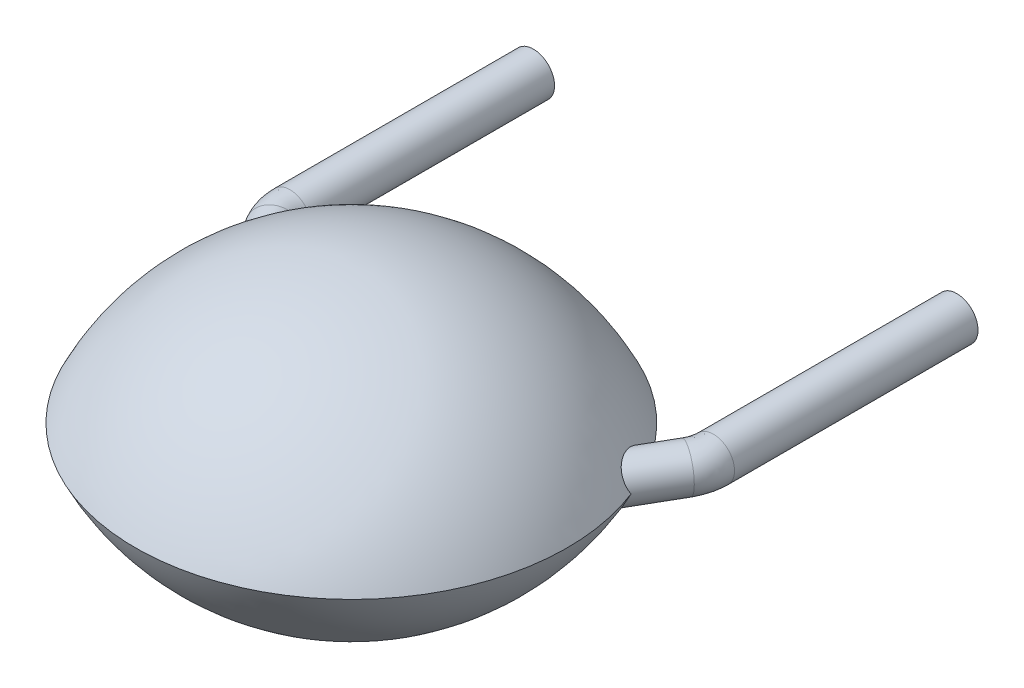
ISO-10303-21;
HEADER;
FILE_DESCRIPTION(('STEP AP214'),'2;1');
FILE_NAME('part.step','',(''),(''),'','','');
FILE_SCHEMA(('AUTOMOTIVE_DESIGN { 1 0 10303 214 1 1 1 1 }'));
ENDSEC;
DATA;
#1=APPLICATION_CONTEXT('core data for automotive mechanical design processes');
#2=APPLICATION_PROTOCOL_DEFINITION('international standard','automotive_design',2000,#1);
#3=PRODUCT_CONTEXT('',#1,'mechanical');
#4=PRODUCT('Part','Part','',(#3));
#5=PRODUCT_RELATED_PRODUCT_CATEGORY('part','',(#4));
#6=PRODUCT_DEFINITION_FORMATION('','',#4);
#7=PRODUCT_DEFINITION_CONTEXT('part definition',#1,'design');
#8=PRODUCT_DEFINITION('design','',#6,#7);
#9=PRODUCT_DEFINITION_SHAPE('','',#8);
#10=(LENGTH_UNIT() NAMED_UNIT(*) SI_UNIT(.MILLI.,.METRE.));
#11=(NAMED_UNIT(*) PLANE_ANGLE_UNIT() SI_UNIT($,.RADIAN.));
#12=(NAMED_UNIT(*) SI_UNIT($,.STERADIAN.) SOLID_ANGLE_UNIT());
#13=UNCERTAINTY_MEASURE_WITH_UNIT(LENGTH_MEASURE(1.E-05),#10,'distance_accuracy_value','');
#14=(GEOMETRIC_REPRESENTATION_CONTEXT(3) GLOBAL_UNCERTAINTY_ASSIGNED_CONTEXT((#13)) GLOBAL_UNIT_ASSIGNED_CONTEXT((#10,
#11,#12)) REPRESENTATION_CONTEXT('',''));
#15=CARTESIAN_POINT('',(0.,0.,0.));
#16=DIRECTION('',(0.,0.,1.));
#17=DIRECTION('',(1.,0.,0.));
#18=AXIS2_PLACEMENT_3D('',#15,#16,#17);
#19=CARTESIAN_POINT('',(5.,0.25,-2.));
#20=DIRECTION('',(0.,0.,-1.));
#21=DIRECTION('',(0.,-1.,0.));
#22=AXIS2_PLACEMENT_3D('',#19,#20,#21);
#23=PLANE('',#22);
#24=CARTESIAN_POINT('',(5.,0.,-2.));
#25=DIRECTION('',(0.,0.,1.));
#26=DIRECTION('',(0.,1.,0.));
#27=AXIS2_PLACEMENT_3D('',#24,#25,#26);
#28=CIRCLE('',#27,0.25);
#29=CARTESIAN_POINT('',(5.,0.25,-2.));
#30=VERTEX_POINT('',#29);
#31=EDGE_CURVE('E11',#30,#30,#28,.T.);
#32=ORIENTED_EDGE('',*,*,#31,.F.);
#33=EDGE_LOOP('',(#32));
#34=FACE_BOUND('',#33,.T.);
#35=ADVANCED_FACE('F17',(#34),#23,.T.);
#36=CARTESIAN_POINT('',(5.,0.,-2.));
#37=DIRECTION('',(0.,0.,-1.));
#38=DIRECTION('',(0.,1.,0.));
#39=AXIS2_PLACEMENT_3D('',#36,#37,#38);
#40=CYLINDRICAL_SURFACE('',#39,0.25);
#41=DIRECTION('',(0.,0.,1.));
#42=VECTOR('',#41,1.);
#43=CARTESIAN_POINT('',(5.,0.25,-2.));
#44=LINE('',#43,#42);
#45=CARTESIAN_POINT('',(5.,0.25,0.875));
#46=VERTEX_POINT('',#45);
#47=EDGE_CURVE('E30',#30,#46,#44,.T.);
#48=ORIENTED_EDGE('',*,*,#47,.T.);
#49=CARTESIAN_POINT('',(5.,0.,0.875));
#50=DIRECTION('',(0.,0.,1.));
#51=DIRECTION('',(0.,1.,0.));
#52=AXIS2_PLACEMENT_3D('',#49,#50,#51);
#53=CIRCLE('',#52,0.25);
#54=EDGE_CURVE('E171',#46,#46,#53,.T.);
#55=ORIENTED_EDGE('',*,*,#54,.F.);
#56=ORIENTED_EDGE('',*,*,#47,.F.);
#57=ORIENTED_EDGE('',*,*,#31,.T.);
#58=EDGE_LOOP('',(#48,#55,#56,#57));
#59=FACE_BOUND('',#58,.T.);
#60=ADVANCED_FACE('F186',(#59),#40,.T.);
#61=CARTESIAN_POINT('',(5.,0.25,0.875));
#62=CARTESIAN_POINT('',(4.5,0.25,0.874999999999999));
#63=CARTESIAN_POINT('',(4.5,-0.25,0.874999999999999));
#64=CARTESIAN_POINT('',(5.,-0.25,0.875));
#65=CARTESIAN_POINT('',(5.5,-0.25,0.874999999999999));
#66=CARTESIAN_POINT('',(5.5,0.25,0.874999999999999));
#67=CARTESIAN_POINT('',(5.,0.25,0.875));
#68=(BOUNDED_CURVE() B_SPLINE_CURVE(3,(#61,#62,#63,#64,#65,#66,#67),.UNSPECIFIED.,.T.,
.F.) B_SPLINE_CURVE_WITH_KNOTS((4,3,4),(0.,0.5,1.),
.UNSPECIFIED.) CURVE() GEOMETRIC_REPRESENTATION_ITEM() RATIONAL_B_SPLINE_CURVE((1.,
0.333333333333334,0.333333333333334,1.,0.333333333333334,0.333333333333334,1.)) REPRESENTATION_ITEM(''));
#69=CARTESIAN_POINT('',(4.5,-4.,0.875));
#70=DIRECTION('',(0.,1.,0.));
#71=AXIS1_PLACEMENT('',#69,#70);
#72=SURFACE_OF_REVOLUTION('',#68,#71);
#73=CARTESIAN_POINT('',(4.933012701892,0.,1.125));
#74=DIRECTION('',(-0.50000000000019,0.,0.866025403784329));
#75=DIRECTION('',(0.,1.,0.));
#76=AXIS2_PLACEMENT_3D('',#73,#74,#75);
#77=CIRCLE('',#76,0.25);
#78=CARTESIAN_POINT('',(4.933012701892,0.25,1.125));
#79=VERTEX_POINT('',#78);
#80=EDGE_CURVE('E165',#79,#79,#77,.T.);
#81=ORIENTED_EDGE('',*,*,#80,.F.);
#82=CARTESIAN_POINT('',(4.5,0.25,0.875));
#83=DIRECTION('',(0.,-1.,0.));
#84=DIRECTION('',(1.,0.,0.));
#85=AXIS2_PLACEMENT_3D('',#82,#83,#84);
#86=CIRCLE('',#85,0.5);
#87=EDGE_CURVE('E168',#46,#79,#86,.T.);
#88=ORIENTED_EDGE('',*,*,#87,.F.);
#89=ORIENTED_EDGE('',*,*,#54,.T.);
#90=ORIENTED_EDGE('',*,*,#87,.T.);
#91=EDGE_LOOP('',(#81,#88,#89,#90));
#92=FACE_BOUND('',#91,.T.);
#93=ADVANCED_FACE('F182',(#92),#72,.T.);
#94=CARTESIAN_POINT('',(4.933012701892,0.,1.125));
#95=DIRECTION('',(0.50000000000019,0.,-0.866025403784329));
#96=DIRECTION('',(0.,1.,0.));
#97=AXIS2_PLACEMENT_3D('',#94,#95,#96);
#98=CYLINDRICAL_SURFACE('',#97,0.25);
#99=DIRECTION('',(-0.50000000000019,0.,0.866025403784329));
#100=VECTOR('',#99,1.);
#101=CARTESIAN_POINT('',(4.933012701892,0.25,1.125));
#102=LINE('',#101,#100);
#103=CARTESIAN_POINT('',(4.666434055664,0.25,1.58672775948));
#104=VERTEX_POINT('',#103);
#105=EDGE_CURVE('E54',#79,#104,#102,.T.);
#106=ORIENTED_EDGE('',*,*,#105,.T.);
#107=CARTESIAN_POINT('',(4.875897351169,0.,1.723926689345));
#108=CARTESIAN_POINT('',(4.872540982405,0.01084227642438,1.729740090572));
#109=CARTESIAN_POINT('',(4.868769330569,0.02204759469085,1.735175871729));
#110=CARTESIAN_POINT('',(4.864530752081,0.03367107109332,1.740189319817));
#111=CARTESIAN_POINT('',(4.859766536993,0.0457510732029,1.744701158777));
#112=CARTESIAN_POINT('',(4.854401502333,0.05831645294804,1.748584468027));
#113=CARTESIAN_POINT('',(4.848360061195,0.07137550323135,1.751683237609));
#114=CARTESIAN_POINT('',(4.836797950486,0.09428918328407,1.755147300411));
#115=CARTESIAN_POINT('',(4.831723135107,0.103836125054,1.756062142666));
#116=CARTESIAN_POINT('',(4.826226847236,0.113635391189,1.756406383654));
#117=CARTESIAN_POINT('',(4.820265639105,0.12367491454,1.756068821169));
#118=CARTESIAN_POINT('',(4.813804730209,0.133907616555,1.75491286856));
#119=CARTESIAN_POINT('',(4.806821876495,0.144251409044,1.752785547068));
#120=CARTESIAN_POINT('',(4.794848866868,0.160731292592,1.747590133745));
#121=CARTESIAN_POINT('',(4.79031284101,0.16671620372,1.745303214288));
#122=CARTESIAN_POINT('',(4.785716656807,0.172522792087,1.74266779359));
#123=CARTESIAN_POINT('',(4.781074044016,0.178132241449,1.739689763102));
#124=CARTESIAN_POINT('',(4.776398967334,0.183528056558,1.736378831949));
#125=CARTESIAN_POINT('',(4.771705626396,0.188696063166,1.732748526928));
#126=CARTESIAN_POINT('',(4.759179835862,0.201838318423,1.722262299956));
#127=CARTESIAN_POINT('',(4.751335644706,0.209391527704,1.714865075885));
#128=CARTESIAN_POINT('',(4.743547461816,0.216223374245,1.706707548266));
#129=CARTESIAN_POINT('',(4.735864131921,0.222317241615,1.697881533801));
#130=CARTESIAN_POINT('',(4.728323305883,0.22767548373,1.688479671417));
#131=CARTESIAN_POINT('',(4.720956843404,0.232308536715,1.678592125432));
#132=CARTESIAN_POINT('',(4.705732593655,0.240656296655,1.656745628688));
#133=CARTESIAN_POINT('',(4.698222891702,0.244023275369,1.645105716297));
#134=CARTESIAN_POINT('',(4.691157728812,0.246543975046,1.633427010177));
#135=CARTESIAN_POINT('',(4.684485672685,0.248325835642,1.621736816374));
#136=CARTESIAN_POINT('',(4.678162267309,0.249457556963,1.610053060865));
#137=CARTESIAN_POINT('',(4.67215474224,0.249999998951,1.598383748017));
#138=CARTESIAN_POINT('',(4.666434055664,0.25,1.58672775948));
#139=(BOUNDED_CURVE() B_SPLINE_CURVE(7,(#107,#108,#109,#110,#111,#112,#113,#114,#115,#116,#117,
#118,#119,#120,#121,#122,#123,#124,#125,#126,#127,#128,#129,#130,#131,#132,#133,#134,#135,#136,
#137,#138),.UNSPECIFIED.,.F.,.F.) B_SPLINE_CURVE_WITH_KNOTS((8,6,6,6,6,8),(0.,0.2829607366,
0.476876740987,0.592090069737,0.784112338456,1.),
.UNSPECIFIED.) CURVE() GEOMETRIC_REPRESENTATION_ITEM() RATIONAL_B_SPLINE_CURVE((1.,1.,1.,1.,1.,
1.,1.,1.,1.,1.,1.,1.,1.,1.,1.,1.,1.,1.,1.,1.,1.,1.,1.,1.,1.,1.,1.,1.,1.,1.,1.,1.)) REPRESENTATION_ITEM(''));
#140=CARTESIAN_POINT('',(4.875897351169,0.,1.723926689345));
#141=VERTEX_POINT('',#140);
#142=EDGE_CURVE('E75',#141,#104,#139,.T.);
#143=ORIENTED_EDGE('',*,*,#142,.F.);
#144=CARTESIAN_POINT('',(4.599479312009,0.,1.202696777298));
#145=CARTESIAN_POINT('',(4.595356552469,-0.01541405153112,1.209837606289));
#146=CARTESIAN_POINT('',(4.591900658883,-0.03060311878865,1.217995583014));
#147=CARTESIAN_POINT('',(4.589079807709,-0.04555296125518,1.227115315096));
#148=CARTESIAN_POINT('',(4.586875581246,-0.0602445642199,1.237160534282));
#149=CARTESIAN_POINT('',(4.585278463779,-0.07465522802705,1.248107287474));
#150=CARTESIAN_POINT('',(4.584285763832,-0.08875899146372,1.259940915168));
#151=CARTESIAN_POINT('',(4.583901962522,-0.102526389287,1.272656817299));
#152=CARTESIAN_POINT('',(4.584367244355,-0.128550561959,1.299090927779));
#153=CARTESIAN_POINT('',(4.585146492927,-0.140837691406,1.312698280922));
#154=CARTESIAN_POINT('',(4.586489918042,-0.152763592932,1.32709955502));
#155=CARTESIAN_POINT('',(4.588416710139,-0.164291632376,1.342308583102));
#156=CARTESIAN_POINT('',(4.590954248349,-0.175369744603,1.358339863002));
#157=CARTESIAN_POINT('',(4.594136308213,-0.185931890159,1.375206042774));
#158=CARTESIAN_POINT('',(4.598005792759,-0.19589665929,1.3929210404));
#159=CARTESIAN_POINT('',(4.606286490343,-0.212489466522,1.426234550433));
#160=CARTESIAN_POINT('',(4.610410624872,-0.219368119093,1.441480409862));
#161=CARTESIAN_POINT('',(4.6150336417,-0.225751284401,1.457279958445));
#162=CARTESIAN_POINT('',(4.620191358102,-0.231567686964,1.473635332808));
#163=CARTESIAN_POINT('',(4.62591899279,-0.236722696908,1.490521369375));
#164=CARTESIAN_POINT('',(4.632248379887,-0.241102647766,1.507882307643));
#165=CARTESIAN_POINT('',(4.63920555972,-0.244578802213,1.525628520922));
#166=CARTESIAN_POINT('',(4.654233152545,-0.249385939618,1.561214666065));
#167=CARTESIAN_POINT('',(4.662304895267,-0.250775467547,1.579116842926));
#168=CARTESIAN_POINT('',(4.670977211036,-0.251011150383,1.597053201445));
#169=CARTESIAN_POINT('',(4.680183974532,-0.249970574655,1.614735276167));
#170=CARTESIAN_POINT('',(4.689838836627,-0.247580817476,1.631875923068));
#171=CARTESIAN_POINT('',(4.699832488122,-0.243821802034,1.64819193055));
#172=CARTESIAN_POINT('',(4.710025260544,-0.238742359547,1.663414606468));
#173=CARTESIAN_POINT('',(4.732418119086,-0.225051503543,1.693914401432));
#174=CARTESIAN_POINT('',(4.744596800414,-0.215963129608,1.708592599341));
#175=CARTESIAN_POINT('',(4.75672207548,-0.205356529617,1.721345299667));
#176=CARTESIAN_POINT('',(4.768656653425,-0.193374682425,1.732018841191));
#177=CARTESIAN_POINT('',(4.780224958713,-0.180262505167,1.740511878496));
#178=CARTESIAN_POINT('',(4.791213677763,-0.166369767619,1.74679666942));
#179=CARTESIAN_POINT('',(4.801400749461,-0.152191085755,1.751019855355));
#180=CARTESIAN_POINT('',(4.822373368245,-0.120565113179,1.756729122048));
#181=CARTESIAN_POINT('',(4.832842605351,-0.102813931319,1.757172014891));
#182=CARTESIAN_POINT('',(4.842227544096,-0.08519036070331,1.755496382669));
#183=CARTESIAN_POINT('',(4.850632622322,-0.06773973952583,1.752009512375));
#184=CARTESIAN_POINT('',(4.858151860673,-0.05049219631199,1.746973892386));
#185=CARTESIAN_POINT('',(4.864841235095,-0.03345827297048,1.740546250343));
#186=CARTESIAN_POINT('',(4.870747957391,-0.0166343911192,1.732845700996));
#187=CARTESIAN_POINT('',(4.875897351169,0.,1.723926689345));
#188=(BOUNDED_CURVE() B_SPLINE_CURVE(8,(#144,#145,#146,#147,#148,#149,#150,#151,#152,#153,#154,
#155,#156,#157,#158,#159,#160,#161,#162,#163,#164,#165,#166,#167,#168,#169,#170,#171,#172,#173,
#174,#175,#176,#177,#178,#179,#180,#181,#182,#183,#184,#185,#186,#187),.UNSPECIFIED.,.F.,
.F.) B_SPLINE_CURVE_WITH_KNOTS((9,7,7,7,7,7,9),(0.,0.184935087976,0.359239167189,0.497202351413,
0.631921481965,0.79275854663,1.),
.UNSPECIFIED.) CURVE() GEOMETRIC_REPRESENTATION_ITEM() RATIONAL_B_SPLINE_CURVE((1.,1.,1.,1.,1.,
1.,1.,1.,1.,1.,1.,1.,1.,1.,1.,1.,1.,1.,1.,1.,1.,1.,1.,1.,1.,1.,1.,1.,1.,1.,1.,1.,1.,1.,1.,1.,1.,
1.,1.,1.,1.,1.,1.,1.)) REPRESENTATION_ITEM(''));
#189=CARTESIAN_POINT('',(4.599479312009,0.,1.202696777298));
#190=VERTEX_POINT('',#189);
#191=EDGE_CURVE('E120',#190,#141,#188,.T.);
#192=ORIENTED_EDGE('',*,*,#191,.F.);
#193=CARTESIAN_POINT('',(4.666434055664,0.25,1.58672775948));
#194=CARTESIAN_POINT('',(4.654044616675,0.250000002271,1.561484083411));
#195=CARTESIAN_POINT('',(4.642386316255,0.247507238727,1.53510553481));
#196=CARTESIAN_POINT('',(4.63149307844,0.242546356814,1.50776923193));
#197=CARTESIAN_POINT('',(4.621451610485,0.235073040205,1.479676795392));
#198=CARTESIAN_POINT('',(4.612381739998,0.225033923775,1.451079072086));
#199=CARTESIAN_POINT('',(4.604438084795,0.212372468024,1.422277504499));
#200=CARTESIAN_POINT('',(4.597802172178,0.197060627946,1.393631729163));
#201=CARTESIAN_POINT('',(4.587972598336,0.162444878381,1.339587464281));
#202=CARTESIAN_POINT('',(4.584527499543,0.143420523682,1.313940059669));
#203=CARTESIAN_POINT('',(4.582656019583,0.122256291706,1.289450784266));
#204=CARTESIAN_POINT('',(4.58251643509,0.0993275862285,1.266765326397));
#205=CARTESIAN_POINT('',(4.584187982623,0.07508669633242,1.246410472558));
#206=CARTESIAN_POINT('',(4.587663196165,0.05005495932707,1.228791123963));
#207=CARTESIAN_POINT('',(4.592843165556,0.0248110282448,1.214190920122));
#208=CARTESIAN_POINT('',(4.599479312009,0.,1.202696777298));
#209=(BOUNDED_CURVE() B_SPLINE_CURVE(8,(#193,#194,#195,#196,#197,#198,#199,#200,#201,#202,#203,
#204,#205,#206,#207,#208),.UNSPECIFIED.,.F.,.F.) B_SPLINE_CURVE_WITH_KNOTS((9,7,9),(0.,
0.519513390265,1.),
.UNSPECIFIED.) CURVE() GEOMETRIC_REPRESENTATION_ITEM() RATIONAL_B_SPLINE_CURVE((1.,1.,1.,1.,1.,
1.,1.,1.,1.,1.,1.,1.,1.,1.,1.,1.)) REPRESENTATION_ITEM(''));
#210=EDGE_CURVE('E152',#104,#190,#209,.T.);
#211=ORIENTED_EDGE('',*,*,#210,.F.);
#212=ORIENTED_EDGE('',*,*,#105,.F.);
#213=ORIENTED_EDGE('',*,*,#80,.T.);
#214=EDGE_LOOP('',(#106,#143,#192,#211,#212,#213));
#215=FACE_BOUND('',#214,.T.);
#216=ADVANCED_FACE('F185',(#215),#98,.T.);
#217=CARTESIAN_POINT('',(2.5,-1.23203125,2.65));
#218=DIRECTION('',(0.,-1.,0.));
#219=DIRECTION('',(-1.,0.,0.));
#220=AXIS2_PLACEMENT_3D('',#217,#218,#219);
#221=SPHERICAL_SURFACE('',#220,2.83203125);
#222=CARTESIAN_POINT('',(2.5,-1.23203125,2.65));
#223=DIRECTION('',(0.,0.,1.));
#224=DIRECTION('',(0.,1.,0.));
#225=AXIS2_PLACEMENT_3D('',#222,#223,#224);
#226=CIRCLE('',#225,2.83203125);
#227=CARTESIAN_POINT('',(2.5,1.6,2.65));
#228=VERTEX_POINT('',#227);
#229=CARTESIAN_POINT('',(-0.05,0.,2.65));
#230=VERTEX_POINT('',#229);
#231=EDGE_CURVE('E66',#228,#230,#226,.T.);
#232=ORIENTED_EDGE('',*,*,#231,.F.);
#233=ORIENTED_EDGE('',*,*,#231,.T.);
#234=CARTESIAN_POINT('',(2.5,0.,2.65));
#235=DIRECTION('',(0.,-1.,0.));
#236=DIRECTION('',(-1.,0.,0.));
#237=AXIS2_PLACEMENT_3D('',#234,#235,#236);
#238=CIRCLE('',#237,2.55);
#239=EDGE_CURVE('E111',#141,#230,#238,.T.);
#240=ORIENTED_EDGE('',*,*,#239,.F.);
#241=ORIENTED_EDGE('',*,*,#142,.T.);
#242=ORIENTED_EDGE('',*,*,#210,.T.);
#243=CARTESIAN_POINT('',(2.5,0.,2.65));
#244=DIRECTION('',(0.,-1.,0.));
#245=DIRECTION('',(-1.,0.,0.));
#246=AXIS2_PLACEMENT_3D('',#243,#244,#245);
#247=CIRCLE('',#246,2.55);
#248=CARTESIAN_POINT('',(0.400520687991,0.,1.202696777298));
#249=VERTEX_POINT('',#248);
#250=EDGE_CURVE('E130',#249,#190,#247,.T.);
#251=ORIENTED_EDGE('',*,*,#250,.F.);
#252=CARTESIAN_POINT('',(0.400520687991,0.,1.202696777298));
#253=CARTESIAN_POINT('',(0.404643447531,0.01541405153032,1.209837606289));
#254=CARTESIAN_POINT('',(0.408099341117,0.0306031187871,1.217995583013));
#255=CARTESIAN_POINT('',(0.41092019229,0.04555296125287,1.227115315095));
#256=CARTESIAN_POINT('',(0.413124418754,0.06024456421688,1.23716053428));
#257=CARTESIAN_POINT('',(0.414721536221,0.07465522802336,1.248107287471));
#258=CARTESIAN_POINT('',(0.415714236168,0.08875899145938,1.259940915165));
#259=CARTESIAN_POINT('',(0.416098037478,0.102526389282,1.272656817295));
#260=CARTESIAN_POINT('',(0.415632755645,0.128550561953,1.299090927772));
#261=CARTESIAN_POINT('',(0.414853507074,0.1408376914,1.312698280915));
#262=CARTESIAN_POINT('',(0.413510081959,0.152763592926,1.327099555012));
#263=CARTESIAN_POINT('',(0.411583289862,0.16429163237,1.342308583094));
#264=CARTESIAN_POINT('',(0.409045751653,0.175369744596,1.358339862993));
#265=CARTESIAN_POINT('',(0.405863691788,0.185931890153,1.375206042764));
#266=CARTESIAN_POINT('',(0.401994207243,0.195896659284,1.39292104039));
#267=CARTESIAN_POINT('',(0.39371350966,0.212489466517,1.426234550422));
#268=CARTESIAN_POINT('',(0.389589375132,0.219368119088,1.44148040985));
#269=CARTESIAN_POINT('',(0.384966358303,0.225751284396,1.457279958434));
#270=CARTESIAN_POINT('',(0.379808641902,0.23156768696,1.473635332797));
#271=CARTESIAN_POINT('',(0.374081007214,0.236722696905,1.490521369364));
#272=CARTESIAN_POINT('',(0.367751620117,0.241102647763,1.507882307633));
#273=CARTESIAN_POINT('',(0.360794440284,0.244578802211,1.525628520912));
#274=CARTESIAN_POINT('',(0.34576684746,0.249385939618,1.561214666056));
#275=CARTESIAN_POINT('',(0.337695104738,0.250775467547,1.579116842917));
#276=CARTESIAN_POINT('',(0.329022788968,0.251011150383,1.597053201436));
#277=CARTESIAN_POINT('',(0.319816025473,0.249970574656,1.614735276158));
#278=CARTESIAN_POINT('',(0.310161163378,0.247580817477,1.63187592306));
#279=CARTESIAN_POINT('',(0.300167511882,0.243821802036,1.648191930542));
#280=CARTESIAN_POINT('',(0.289974739461,0.23874235955,1.663414606461));
#281=CARTESIAN_POINT('',(0.267581880919,0.225051503547,1.693914401426));
#282=CARTESIAN_POINT('',(0.255403199592,0.215963129613,1.708592599335));
#283=CARTESIAN_POINT('',(0.243277924526,0.205356529622,1.721345299662));
#284=CARTESIAN_POINT('',(0.231343346581,0.193374682431,1.732018841186));
#285=CARTESIAN_POINT('',(0.219775041292,0.180262505174,1.740511878492));
#286=CARTESIAN_POINT('',(0.208786322243,0.166369767626,1.746796669416));
#287=CARTESIAN_POINT('',(0.198599250545,0.152191085762,1.751019855352));
#288=CARTESIAN_POINT('',(0.177626631759,0.120565113186,1.756729122048));
#289=CARTESIAN_POINT('',(0.167157394652,0.102813931325,1.757172014891));
#290=CARTESIAN_POINT('',(0.157772455906,0.08519036070813,1.75549638267));
#291=CARTESIAN_POINT('',(0.14936737768,0.0677397395299,1.752009512376));
#292=CARTESIAN_POINT('',(0.141848139328,0.05049219631477,1.746973892388));
#293=CARTESIAN_POINT('',(0.135158764906,0.03345827297244,1.740546250344));
#294=CARTESIAN_POINT('',(0.129252042609,0.01663439112015,1.732845700996));
#295=CARTESIAN_POINT('',(0.124102648831,0.,1.723926689345));
#296=(BOUNDED_CURVE() B_SPLINE_CURVE(8,(#252,#253,#254,#255,#256,#257,#258,#259,#260,#261,#262,
#263,#264,#265,#266,#267,#268,#269,#270,#271,#272,#273,#274,#275,#276,#277,#278,#279,#280,#281,
#282,#283,#284,#285,#286,#287,#288,#289,#290,#291,#292,#293,#294,#295),.UNSPECIFIED.,.F.,
.F.) B_SPLINE_CURVE_WITH_KNOTS((9,7,7,7,7,7,9),(0.,0.184935087966,0.359239167175,0.497202351404,
0.631921481957,0.792758546619,1.),
.UNSPECIFIED.) CURVE() GEOMETRIC_REPRESENTATION_ITEM() RATIONAL_B_SPLINE_CURVE((1.,1.,1.,1.,1.,
1.,1.,1.,1.,1.,1.,1.,1.,1.,1.,1.,1.,1.,1.,1.,1.,1.,1.,1.,1.,1.,1.,1.,1.,1.,1.,1.,1.,1.,1.,1.,1.,
1.,1.,1.,1.,1.,1.,1.)) REPRESENTATION_ITEM(''));
#297=CARTESIAN_POINT('',(0.124102648831,0.,1.723926689345));
#298=VERTEX_POINT('',#297);
#299=EDGE_CURVE('E126',#249,#298,#296,.T.);
#300=ORIENTED_EDGE('',*,*,#299,.T.);
#301=CARTESIAN_POINT('',(2.5,0.,2.65));
#302=DIRECTION('',(0.,-1.,0.));
#303=DIRECTION('',(-1.,0.,0.));
#304=AXIS2_PLACEMENT_3D('',#301,#302,#303);
#305=CIRCLE('',#304,2.55);
#306=EDGE_CURVE('E124',#230,#298,#305,.T.);
#307=ORIENTED_EDGE('',*,*,#306,.F.);
#308=EDGE_LOOP('',(#232,#233,#240,#241,#242,#251,#300,#307));
#309=FACE_BOUND('',#308,.T.);
#310=ADVANCED_FACE('F110',(#309),#221,.T.);
#311=CARTESIAN_POINT('',(2.5,1.23203125,2.65));
#312=DIRECTION('',(0.,-1.,0.));
#313=DIRECTION('',(-1.,0.,0.));
#314=AXIS2_PLACEMENT_3D('',#311,#312,#313);
#315=SPHERICAL_SURFACE('',#314,2.83203125);
#316=CARTESIAN_POINT('',(2.5,1.23203125,2.65));
#317=DIRECTION('',(0.,0.,1.));
#318=DIRECTION('',(-0.900413793103215,-0.435034482759104,0.));
#319=AXIS2_PLACEMENT_3D('',#316,#317,#318);
#320=CIRCLE('',#319,2.83203125);
#321=CARTESIAN_POINT('',(2.5,-1.6,2.65));
#322=VERTEX_POINT('',#321);
#323=EDGE_CURVE('E118',#230,#322,#320,.T.);
#324=ORIENTED_EDGE('',*,*,#323,.F.);
#325=ORIENTED_EDGE('',*,*,#306,.T.);
#326=CARTESIAN_POINT('',(0.124102648831,0.,1.723926689345));
#327=CARTESIAN_POINT('',(0.127459017594,-0.01084227642388,1.729740090572));
#328=CARTESIAN_POINT('',(0.131230669431,-0.02204759468982,1.735175871728));
#329=CARTESIAN_POINT('',(0.135469247918,-0.03367107109172,1.740189319817));
#330=CARTESIAN_POINT('',(0.140233463006,-0.04575107320069,1.744701158776));
#331=CARTESIAN_POINT('',(0.145598497665,-0.05831645294516,1.748584468026));
#332=CARTESIAN_POINT('',(0.151639938803,-0.07137550322775,1.751683237608));
#333=CARTESIAN_POINT('',(0.163202049511,-0.09428918327967,1.75514730041));
#334=CARTESIAN_POINT('',(0.168276864891,-0.103836125049,1.756062142666));
#335=CARTESIAN_POINT('',(0.173773152762,-0.113635391184,1.756406383654));
#336=CARTESIAN_POINT('',(0.179734360892,-0.123674914535,1.75606882117));
#337=CARTESIAN_POINT('',(0.186195269788,-0.133907616551,1.754912868561));
#338=CARTESIAN_POINT('',(0.193178123502,-0.144251409039,1.752785547069));
#339=CARTESIAN_POINT('',(0.205151133128,-0.160731292587,1.747590133747));
#340=CARTESIAN_POINT('',(0.209687158985,-0.166716203714,1.745303214291));
#341=CARTESIAN_POINT('',(0.214283343188,-0.172522792081,1.742667793593));
#342=CARTESIAN_POINT('',(0.218925955979,-0.178132241442,1.739689763105));
#343=CARTESIAN_POINT('',(0.223601032661,-0.183528056552,1.736378831953));
#344=CARTESIAN_POINT('',(0.228294373599,-0.18869606316,1.732748526932));
#345=CARTESIAN_POINT('',(0.240820164131,-0.201838318417,1.722262299962));
#346=CARTESIAN_POINT('',(0.248664355288,-0.2093915277,1.71486507589));
#347=CARTESIAN_POINT('',(0.256452538179,-0.216223374241,1.706707548271));
#348=CARTESIAN_POINT('',(0.264135868075,-0.222317241612,1.697881533806));
#349=CARTESIAN_POINT('',(0.271676694112,-0.227675483727,1.688479671424));
#350=CARTESIAN_POINT('',(0.27904315659,-0.232308536711,1.67859212544));
#351=CARTESIAN_POINT('',(0.294267406341,-0.240656296653,1.656745628695));
#352=CARTESIAN_POINT('',(0.301777108295,-0.244023275367,1.645105716302));
#353=CARTESIAN_POINT('',(0.308842271186,-0.246543975046,1.633427010181));
#354=CARTESIAN_POINT('',(0.315514327313,-0.248325835642,1.621736816377));
#355=CARTESIAN_POINT('',(0.321837732689,-0.249457556963,1.610053060867));
#356=CARTESIAN_POINT('',(0.327845257759,-0.249999998951,1.598383748018));
#357=CARTESIAN_POINT('',(0.333565944336,-0.25,1.58672775948));
#358=(BOUNDED_CURVE() B_SPLINE_CURVE(7,(#326,#327,#328,#329,#330,#331,#332,#333,#334,#335,#336,
#337,#338,#339,#340,#341,#342,#343,#344,#345,#346,#347,#348,#349,#350,#351,#352,#353,#354,#355,
#356,#357),.UNSPECIFIED.,.F.,.F.) B_SPLINE_CURVE_WITH_KNOTS((8,6,6,6,6,8),(0.,0.282960736619,
0.476876741029,0.592090069778,0.784112338476,1.),
.UNSPECIFIED.) CURVE() GEOMETRIC_REPRESENTATION_ITEM() RATIONAL_B_SPLINE_CURVE((1.,1.,1.,1.,1.,
1.,1.,1.,1.,1.,1.,1.,1.,1.,1.,1.,1.,1.,1.,1.,1.,1.,1.,1.,1.,1.,1.,1.,1.,1.,1.,1.)) REPRESENTATION_ITEM(''));
#359=CARTESIAN_POINT('',(0.333565944336,-0.25,1.58672775948));
#360=VERTEX_POINT('',#359);
#361=EDGE_CURVE('E141',#298,#360,#358,.T.);
#362=ORIENTED_EDGE('',*,*,#361,.T.);
#363=CARTESIAN_POINT('',(0.333565944336,-0.25,1.58672775948));
#364=CARTESIAN_POINT('',(0.345955383325,-0.250000002271,1.561484083411));
#365=CARTESIAN_POINT('',(0.357613683746,-0.247507238727,1.535105534809));
#366=CARTESIAN_POINT('',(0.36850692156,-0.242546356814,1.507769231928));
#367=CARTESIAN_POINT('',(0.378548389516,-0.235073040204,1.47967679539));
#368=CARTESIAN_POINT('',(0.387618260003,-0.225033923774,1.451079072083));
#369=CARTESIAN_POINT('',(0.395561915206,-0.212372468022,1.422277504495));
#370=CARTESIAN_POINT('',(0.402197827823,-0.197060627944,1.393631729159));
#371=CARTESIAN_POINT('',(0.412027401665,-0.162444878378,1.339587464277));
#372=CARTESIAN_POINT('',(0.415472500457,-0.143420523679,1.313940059666));
#373=CARTESIAN_POINT('',(0.417343980417,-0.122256291704,1.289450784263));
#374=CARTESIAN_POINT('',(0.41748356491,-0.09932758622645,1.266765326395));
#375=CARTESIAN_POINT('',(0.415812017376,-0.07508669633078,1.246410472557));
#376=CARTESIAN_POINT('',(0.412336803835,-0.050054959326,1.228791123962));
#377=CARTESIAN_POINT('',(0.407156834444,-0.02481102824427,1.214190920122));
#378=CARTESIAN_POINT('',(0.400520687991,0.,1.202696777298));
#379=(BOUNDED_CURVE() B_SPLINE_CURVE(8,(#363,#364,#365,#366,#367,#368,#369,#370,#371,#372,#373,
#374,#375,#376,#377,#378),.UNSPECIFIED.,.F.,.F.) B_SPLINE_CURVE_WITH_KNOTS((9,7,9),(0.,
0.519513390275,1.),
.UNSPECIFIED.) CURVE() GEOMETRIC_REPRESENTATION_ITEM() RATIONAL_B_SPLINE_CURVE((1.,1.,1.,1.,1.,
1.,1.,1.,1.,1.,1.,1.,1.,1.,1.,1.)) REPRESENTATION_ITEM(''));
#380=EDGE_CURVE('E133',#360,#249,#379,.T.);
#381=ORIENTED_EDGE('',*,*,#380,.T.);
#382=ORIENTED_EDGE('',*,*,#250,.T.);
#383=ORIENTED_EDGE('',*,*,#191,.T.);
#384=ORIENTED_EDGE('',*,*,#239,.T.);
#385=ORIENTED_EDGE('',*,*,#323,.T.);
#386=EDGE_LOOP('',(#324,#325,#362,#381,#382,#383,#384,#385));
#387=FACE_BOUND('',#386,.T.);
#388=ADVANCED_FACE('F117',(#387),#315,.T.);
#389=CARTESIAN_POINT('',(0.06698729810778,0.,1.125));
#390=DIRECTION('',(-0.50000000000019,0.,-0.866025403784329));
#391=DIRECTION('',(0.,-1.,0.));
#392=AXIS2_PLACEMENT_3D('',#389,#390,#391);
#393=CYLINDRICAL_SURFACE('',#392,0.25);
#394=DIRECTION('',(0.50000000000019,0.,0.866025403784329));
#395=VECTOR('',#394,1.);
#396=CARTESIAN_POINT('',(0.06698729810778,-0.25,1.125));
#397=LINE('',#396,#395);
#398=CARTESIAN_POINT('',(0.06698729810778,-0.25,1.125));
#399=VERTEX_POINT('',#398);
#400=EDGE_CURVE('E242',#399,#360,#397,.T.);
#401=ORIENTED_EDGE('',*,*,#400,.T.);
#402=ORIENTED_EDGE('',*,*,#361,.F.);
#403=ORIENTED_EDGE('',*,*,#299,.F.);
#404=ORIENTED_EDGE('',*,*,#380,.F.);
#405=ORIENTED_EDGE('',*,*,#400,.F.);
#406=CARTESIAN_POINT('',(0.06698729810778,0.,1.125));
#407=DIRECTION('',(0.50000000000019,0.,0.866025403784329));
#408=DIRECTION('',(0.,-1.,0.));
#409=AXIS2_PLACEMENT_3D('',#406,#407,#408);
#410=CIRCLE('',#409,0.25);
#411=EDGE_CURVE('E228',#399,#399,#410,.T.);
#412=ORIENTED_EDGE('',*,*,#411,.T.);
#413=EDGE_LOOP('',(#401,#402,#403,#404,#405,#412));
#414=FACE_BOUND('',#413,.T.);
#415=ADVANCED_FACE('F194',(#414),#393,.T.);
#416=CARTESIAN_POINT('',(0.,-0.25,0.875));
#417=CARTESIAN_POINT('',(0.499999999999999,-0.25,0.874999999999999));
#418=CARTESIAN_POINT('',(0.499999999999999,0.25,0.874999999999999));
#419=CARTESIAN_POINT('',(0.,0.25,0.875));
#420=CARTESIAN_POINT('',(-0.499999999999999,0.25,0.874999999999999));
#421=CARTESIAN_POINT('',(-0.499999999999999,-0.25,0.874999999999999));
#422=CARTESIAN_POINT('',(0.,-0.25,0.875));
#423=(BOUNDED_CURVE() B_SPLINE_CURVE(3,(#416,#417,#418,#419,#420,#421,#422),.UNSPECIFIED.,.T.,
.F.) B_SPLINE_CURVE_WITH_KNOTS((4,3,4),(0.,0.5,1.),
.UNSPECIFIED.) CURVE() GEOMETRIC_REPRESENTATION_ITEM() RATIONAL_B_SPLINE_CURVE((1.,
0.333333333333334,0.333333333333334,1.,0.333333333333334,0.333333333333334,1.)) REPRESENTATION_ITEM(''));
#424=CARTESIAN_POINT('',(0.5,4.,0.875));
#425=DIRECTION('',(0.,-1.,0.));
#426=AXIS1_PLACEMENT('',#424,#425);
#427=SURFACE_OF_REVOLUTION('',#423,#426);
#428=ORIENTED_EDGE('',*,*,#411,.F.);
#429=CARTESIAN_POINT('',(0.5,-0.25,0.875));
#430=DIRECTION('',(0.,1.,0.));
#431=DIRECTION('',(-1.,0.,0.));
#432=AXIS2_PLACEMENT_3D('',#429,#430,#431);
#433=CIRCLE('',#432,0.5);
#434=CARTESIAN_POINT('',(0.,-0.25,0.875));
#435=VERTEX_POINT('',#434);
#436=EDGE_CURVE('E232',#435,#399,#433,.T.);
#437=ORIENTED_EDGE('',*,*,#436,.F.);
#438=CARTESIAN_POINT('',(0.,0.,0.875));
#439=DIRECTION('',(0.,0.,1.));
#440=DIRECTION('',(0.,-1.,0.));
#441=AXIS2_PLACEMENT_3D('',#438,#439,#440);
#442=CIRCLE('',#441,0.25);
#443=EDGE_CURVE('E222',#435,#435,#442,.T.);
#444=ORIENTED_EDGE('',*,*,#443,.T.);
#445=ORIENTED_EDGE('',*,*,#436,.T.);
#446=EDGE_LOOP('',(#428,#437,#444,#445));
#447=FACE_BOUND('',#446,.T.);
#448=ADVANCED_FACE('F19',(#447),#427,.T.);
#449=CARTESIAN_POINT('',(0.,0.,-2.));
#450=DIRECTION('',(0.,0.,-1.));
#451=DIRECTION('',(0.,-1.,0.));
#452=AXIS2_PLACEMENT_3D('',#449,#450,#451);
#453=CYLINDRICAL_SURFACE('',#452,0.25);
#454=DIRECTION('',(0.,0.,1.));
#455=VECTOR('',#454,1.);
#456=CARTESIAN_POINT('',(0.,-0.25,-2.));
#457=LINE('',#456,#455);
#458=CARTESIAN_POINT('',(0.,-0.25,-2.));
#459=VERTEX_POINT('',#458);
#460=EDGE_CURVE('E218',#459,#435,#457,.T.);
#461=ORIENTED_EDGE('',*,*,#460,.T.);
#462=ORIENTED_EDGE('',*,*,#443,.F.);
#463=ORIENTED_EDGE('',*,*,#460,.F.);
#464=CARTESIAN_POINT('',(0.,0.,-2.));
#465=DIRECTION('',(0.,0.,1.));
#466=DIRECTION('',(0.,-1.,0.));
#467=AXIS2_PLACEMENT_3D('',#464,#465,#466);
#468=CIRCLE('',#467,0.25);
#469=EDGE_CURVE('E215',#459,#459,#468,.T.);
#470=ORIENTED_EDGE('',*,*,#469,.T.);
#471=EDGE_LOOP('',(#461,#462,#463,#470));
#472=FACE_BOUND('',#471,.T.);
#473=ADVANCED_FACE('F203',(#472),#453,.T.);
#474=CARTESIAN_POINT('',(0.,-0.25,-2.));
#475=DIRECTION('',(0.,0.,-1.));
#476=DIRECTION('',(0.,-1.,0.));
#477=AXIS2_PLACEMENT_3D('',#474,#475,#476);
#478=PLANE('',#477);
#479=ORIENTED_EDGE('',*,*,#469,.F.);
#480=EDGE_LOOP('',(#479));
#481=FACE_BOUND('',#480,.T.);
#482=ADVANCED_FACE('F206',(#481),#478,.T.);
#483=CLOSED_SHELL('',(#35,#60,#93,#216,#310,#388,#415,#448,#473,#482));
#484=MANIFOLD_SOLID_BREP('B1',#483);
#485=ADVANCED_BREP_SHAPE_REPRESENTATION('',(#18,#484),#14);
#486=SHAPE_DEFINITION_REPRESENTATION(#9,#485);
ENDSEC;
END-ISO-10303-21;
